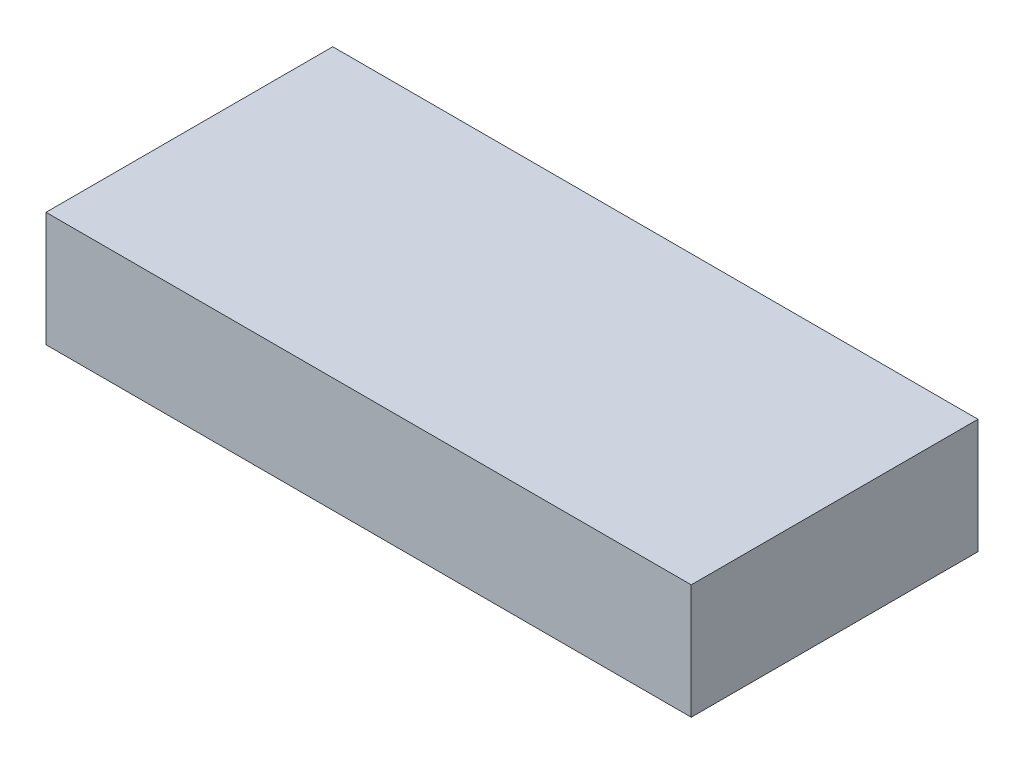
ISO-10303-21;
HEADER;
FILE_DESCRIPTION(('STEP AP214'),'2;1');
FILE_NAME('part.step','',(''),(''),'','','');
FILE_SCHEMA(('AUTOMOTIVE_DESIGN { 1 0 10303 214 1 1 1 1 }'));
ENDSEC;
DATA;
#1=APPLICATION_CONTEXT('core data for automotive mechanical design processes');
#2=APPLICATION_PROTOCOL_DEFINITION('international standard','automotive_design',2000,#1);
#3=PRODUCT_CONTEXT('',#1,'mechanical');
#4=PRODUCT('Part','Part','',(#3));
#5=PRODUCT_RELATED_PRODUCT_CATEGORY('part','',(#4));
#6=PRODUCT_DEFINITION_FORMATION('','',#4);
#7=PRODUCT_DEFINITION_CONTEXT('part definition',#1,'design');
#8=PRODUCT_DEFINITION('design','',#6,#7);
#9=PRODUCT_DEFINITION_SHAPE('','',#8);
#10=(LENGTH_UNIT() NAMED_UNIT(*) SI_UNIT(.MILLI.,.METRE.));
#11=(NAMED_UNIT(*) PLANE_ANGLE_UNIT() SI_UNIT($,.RADIAN.));
#12=(NAMED_UNIT(*) SI_UNIT($,.STERADIAN.) SOLID_ANGLE_UNIT());
#13=UNCERTAINTY_MEASURE_WITH_UNIT(LENGTH_MEASURE(1.E-05),#10,'distance_accuracy_value','');
#14=(GEOMETRIC_REPRESENTATION_CONTEXT(3) GLOBAL_UNCERTAINTY_ASSIGNED_CONTEXT((#13)) GLOBAL_UNIT_ASSIGNED_CONTEXT((#10,
#11,#12)) REPRESENTATION_CONTEXT('',''));
#15=CARTESIAN_POINT('',(0.,0.,0.));
#16=DIRECTION('',(0.,0.,1.));
#17=DIRECTION('',(1.,0.,0.));
#18=AXIS2_PLACEMENT_3D('',#15,#16,#17);
#19=CARTESIAN_POINT('',(22.5,-4.,20.));
#20=DIRECTION('',(-1.,0.,0.));
#21=DIRECTION('',(0.,-1.,0.));
#22=AXIS2_PLACEMENT_3D('',#19,#20,#21);
#23=PLANE('',#22);
#24=DIRECTION('',(0.,1.,0.));
#25=VECTOR('',#24,1.);
#26=CARTESIAN_POINT('',(22.5,-4.,0.));
#27=LINE('',#26,#25);
#28=CARTESIAN_POINT('',(22.5,-4.,0.));
#29=VERTEX_POINT('',#28);
#30=CARTESIAN_POINT('',(22.5,4.,0.));
#31=VERTEX_POINT('',#30);
#32=EDGE_CURVE('E104',#29,#31,#27,.T.);
#33=ORIENTED_EDGE('',*,*,#32,.T.);
#34=DIRECTION('',(0.,0.,-1.));
#35=VECTOR('',#34,1.);
#36=CARTESIAN_POINT('',(22.5,4.,20.));
#37=LINE('',#36,#35);
#38=CARTESIAN_POINT('',(22.5,4.,20.));
#39=VERTEX_POINT('',#38);
#40=EDGE_CURVE('E11',#39,#31,#37,.T.);
#41=ORIENTED_EDGE('',*,*,#40,.F.);
#42=DIRECTION('',(0.,1.,0.));
#43=VECTOR('',#42,1.);
#44=CARTESIAN_POINT('',(22.5,-4.,20.));
#45=LINE('',#44,#43);
#46=CARTESIAN_POINT('',(22.5,-4.,20.));
#47=VERTEX_POINT('',#46);
#48=EDGE_CURVE('E92',#47,#39,#45,.T.);
#49=ORIENTED_EDGE('',*,*,#48,.F.);
#50=DIRECTION('',(0.,0.,-1.));
#51=VECTOR('',#50,1.);
#52=CARTESIAN_POINT('',(22.5,-4.,20.));
#53=LINE('',#52,#51);
#54=EDGE_CURVE('E100',#47,#29,#53,.T.);
#55=ORIENTED_EDGE('',*,*,#54,.T.);
#56=EDGE_LOOP('',(#33,#41,#49,#55));
#57=FACE_BOUND('',#56,.T.);
#58=ADVANCED_FACE('F41',(#57),#23,.F.);
#59=CARTESIAN_POINT('',(-22.5,4.,20.));
#60=DIRECTION('',(0.,-1.,0.));
#61=DIRECTION('',(0.,0.,-1.));
#62=AXIS2_PLACEMENT_3D('',#59,#60,#61);
#63=PLANE('',#62);
#64=DIRECTION('',(-1.,0.,0.));
#65=VECTOR('',#64,1.);
#66=CARTESIAN_POINT('',(-22.5,4.,0.));
#67=LINE('',#66,#65);
#68=CARTESIAN_POINT('',(-22.5,4.,0.));
#69=VERTEX_POINT('',#68);
#70=EDGE_CURVE('E96',#31,#69,#67,.T.);
#71=ORIENTED_EDGE('',*,*,#70,.T.);
#72=DIRECTION('',(0.,0.,-1.));
#73=VECTOR('',#72,1.);
#74=CARTESIAN_POINT('',(-22.5,4.,20.));
#75=LINE('',#74,#73);
#76=CARTESIAN_POINT('',(-22.5,4.,20.));
#77=VERTEX_POINT('',#76);
#78=EDGE_CURVE('E49',#77,#69,#75,.T.);
#79=ORIENTED_EDGE('',*,*,#78,.F.);
#80=DIRECTION('',(-1.,0.,0.));
#81=VECTOR('',#80,1.);
#82=CARTESIAN_POINT('',(-22.5,4.,20.));
#83=LINE('',#82,#81);
#84=EDGE_CURVE('E87',#39,#77,#83,.T.);
#85=ORIENTED_EDGE('',*,*,#84,.F.);
#86=ORIENTED_EDGE('',*,*,#40,.T.);
#87=EDGE_LOOP('',(#71,#79,#85,#86));
#88=FACE_BOUND('',#87,.T.);
#89=ADVANCED_FACE('F95',(#88),#63,.F.);
#90=CARTESIAN_POINT('',(-22.5,-4.,20.));
#91=DIRECTION('',(1.,0.,0.));
#92=DIRECTION('',(0.,1.,0.));
#93=AXIS2_PLACEMENT_3D('',#90,#91,#92);
#94=PLANE('',#93);
#95=DIRECTION('',(0.,-1.,0.));
#96=VECTOR('',#95,1.);
#97=CARTESIAN_POINT('',(-22.5,-4.,0.));
#98=LINE('',#97,#96);
#99=CARTESIAN_POINT('',(-22.5,-4.,0.));
#100=VERTEX_POINT('',#99);
#101=EDGE_CURVE('E74',#69,#100,#98,.T.);
#102=ORIENTED_EDGE('',*,*,#101,.T.);
#103=DIRECTION('',(0.,0.,-1.));
#104=VECTOR('',#103,1.);
#105=CARTESIAN_POINT('',(-22.5,-4.,20.));
#106=LINE('',#105,#104);
#107=CARTESIAN_POINT('',(-22.5,-4.,20.));
#108=VERTEX_POINT('',#107);
#109=EDGE_CURVE('E97',#108,#100,#106,.T.);
#110=ORIENTED_EDGE('',*,*,#109,.F.);
#111=DIRECTION('',(0.,-1.,0.));
#112=VECTOR('',#111,1.);
#113=CARTESIAN_POINT('',(-22.5,-4.,20.));
#114=LINE('',#113,#112);
#115=EDGE_CURVE('E90',#77,#108,#114,.T.);
#116=ORIENTED_EDGE('',*,*,#115,.F.);
#117=ORIENTED_EDGE('',*,*,#78,.T.);
#118=EDGE_LOOP('',(#102,#110,#116,#117));
#119=FACE_BOUND('',#118,.T.);
#120=ADVANCED_FACE('F98',(#119),#94,.F.);
#121=CARTESIAN_POINT('',(-22.5,-4.,20.));
#122=DIRECTION('',(0.,1.,0.));
#123=DIRECTION('',(0.,0.,1.));
#124=AXIS2_PLACEMENT_3D('',#121,#122,#123);
#125=PLANE('',#124);
#126=DIRECTION('',(1.,0.,0.));
#127=VECTOR('',#126,1.);
#128=CARTESIAN_POINT('',(-22.5,-4.,0.));
#129=LINE('',#128,#127);
#130=EDGE_CURVE('E80',#100,#29,#129,.T.);
#131=ORIENTED_EDGE('',*,*,#130,.T.);
#132=ORIENTED_EDGE('',*,*,#54,.F.);
#133=DIRECTION('',(1.,0.,0.));
#134=VECTOR('',#133,1.);
#135=CARTESIAN_POINT('',(-22.5,-4.,20.));
#136=LINE('',#135,#134);
#137=EDGE_CURVE('E57',#108,#47,#136,.T.);
#138=ORIENTED_EDGE('',*,*,#137,.F.);
#139=ORIENTED_EDGE('',*,*,#109,.T.);
#140=EDGE_LOOP('',(#131,#132,#138,#139));
#141=FACE_BOUND('',#140,.T.);
#142=ADVANCED_FACE('F111',(#141),#125,.F.);
#143=CARTESIAN_POINT('',(0.,0.,20.));
#144=DIRECTION('',(0.,0.,-1.));
#145=DIRECTION('',(-1.,0.,0.));
#146=AXIS2_PLACEMENT_3D('',#143,#144,#145);
#147=PLANE('',#146);
#148=ORIENTED_EDGE('',*,*,#48,.T.);
#149=ORIENTED_EDGE('',*,*,#84,.T.);
#150=ORIENTED_EDGE('',*,*,#115,.T.);
#151=ORIENTED_EDGE('',*,*,#137,.T.);
#152=EDGE_LOOP('',(#148,#149,#150,#151));
#153=FACE_BOUND('',#152,.T.);
#154=ADVANCED_FACE('F88',(#153),#147,.F.);
#155=CARTESIAN_POINT('',(0.,0.,0.));
#156=DIRECTION('',(0.,0.,-1.));
#157=DIRECTION('',(-1.,0.,0.));
#158=AXIS2_PLACEMENT_3D('',#155,#156,#157);
#159=PLANE('',#158);
#160=ORIENTED_EDGE('',*,*,#32,.F.);
#161=ORIENTED_EDGE('',*,*,#130,.F.);
#162=ORIENTED_EDGE('',*,*,#101,.F.);
#163=ORIENTED_EDGE('',*,*,#70,.F.);
#164=EDGE_LOOP('',(#160,#161,#162,#163));
#165=FACE_BOUND('',#164,.T.);
#166=ADVANCED_FACE('F114',(#165),#159,.T.);
#167=CLOSED_SHELL('',(#58,#89,#120,#142,#154,#166));
#168=MANIFOLD_SOLID_BREP('B2',#167);
#169=ADVANCED_BREP_SHAPE_REPRESENTATION('',(#18,#168),#14);
#170=SHAPE_DEFINITION_REPRESENTATION(#9,#169);
ENDSEC;
END-ISO-10303-21;
